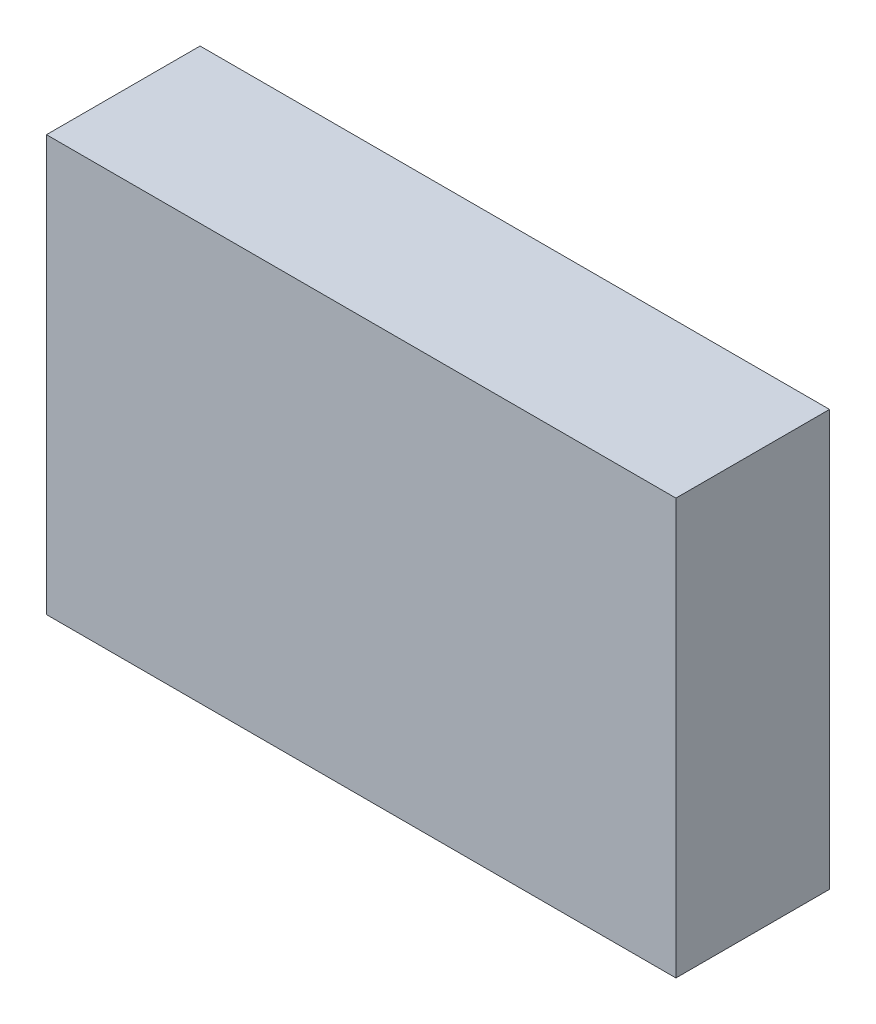
ISO-10303-21;
HEADER;
FILE_DESCRIPTION(('STEP AP214'),'2;1');
FILE_NAME('part.step','',(''),(''),'','','');
FILE_SCHEMA(('AUTOMOTIVE_DESIGN { 1 0 10303 214 1 1 1 1 }'));
ENDSEC;
DATA;
#1=APPLICATION_CONTEXT('core data for automotive mechanical design processes');
#2=APPLICATION_PROTOCOL_DEFINITION('international standard','automotive_design',2000,#1);
#3=PRODUCT_CONTEXT('',#1,'mechanical');
#4=PRODUCT('Part','Part','',(#3));
#5=PRODUCT_RELATED_PRODUCT_CATEGORY('part','',(#4));
#6=PRODUCT_DEFINITION_FORMATION('','',#4);
#7=PRODUCT_DEFINITION_CONTEXT('part definition',#1,'design');
#8=PRODUCT_DEFINITION('design','',#6,#7);
#9=PRODUCT_DEFINITION_SHAPE('','',#8);
#10=(LENGTH_UNIT() NAMED_UNIT(*) SI_UNIT(.MILLI.,.METRE.));
#11=(NAMED_UNIT(*) PLANE_ANGLE_UNIT() SI_UNIT($,.RADIAN.));
#12=(NAMED_UNIT(*) SI_UNIT($,.STERADIAN.) SOLID_ANGLE_UNIT());
#13=UNCERTAINTY_MEASURE_WITH_UNIT(LENGTH_MEASURE(1.E-05),#10,'distance_accuracy_value','');
#14=(GEOMETRIC_REPRESENTATION_CONTEXT(3) GLOBAL_UNCERTAINTY_ASSIGNED_CONTEXT((#13)) GLOBAL_UNIT_ASSIGNED_CONTEXT((#10,
#11,#12)) REPRESENTATION_CONTEXT('',''));
#15=CARTESIAN_POINT('',(0.,0.,0.));
#16=DIRECTION('',(0.,0.,1.));
#17=DIRECTION('',(1.,0.,0.));
#18=AXIS2_PLACEMENT_3D('',#15,#16,#17);
#19=CARTESIAN_POINT('',(104.5,-69.,25.5));
#20=DIRECTION('',(-1.,0.,0.));
#21=DIRECTION('',(0.,0.,1.));
#22=AXIS2_PLACEMENT_3D('',#19,#20,#21);
#23=PLANE('',#22);
#24=DIRECTION('',(0.,1.,0.));
#25=VECTOR('',#24,1.);
#26=CARTESIAN_POINT('',(104.5,-69.,-25.5));
#27=LINE('',#26,#25);
#28=CARTESIAN_POINT('',(104.5,-69.,-25.5));
#29=VERTEX_POINT('',#28);
#30=CARTESIAN_POINT('',(104.5,69.,-25.5));
#31=VERTEX_POINT('',#30);
#32=EDGE_CURVE('E100',#29,#31,#27,.T.);
#33=ORIENTED_EDGE('',*,*,#32,.T.);
#34=DIRECTION('',(0.,0.,-1.));
#35=VECTOR('',#34,1.);
#36=CARTESIAN_POINT('',(104.5,69.,25.5));
#37=LINE('',#36,#35);
#38=CARTESIAN_POINT('',(104.5,69.,25.5));
#39=VERTEX_POINT('',#38);
#40=EDGE_CURVE('E11',#39,#31,#37,.T.);
#41=ORIENTED_EDGE('',*,*,#40,.F.);
#42=DIRECTION('',(0.,1.,0.));
#43=VECTOR('',#42,1.);
#44=CARTESIAN_POINT('',(104.5,-69.,25.5));
#45=LINE('',#44,#43);
#46=CARTESIAN_POINT('',(104.5,-69.,25.5));
#47=VERTEX_POINT('',#46);
#48=EDGE_CURVE('E88',#47,#39,#45,.T.);
#49=ORIENTED_EDGE('',*,*,#48,.F.);
#50=DIRECTION('',(0.,0.,-1.));
#51=VECTOR('',#50,1.);
#52=CARTESIAN_POINT('',(104.5,-69.,25.5));
#53=LINE('',#52,#51);
#54=EDGE_CURVE('E96',#47,#29,#53,.T.);
#55=ORIENTED_EDGE('',*,*,#54,.T.);
#56=EDGE_LOOP('',(#33,#41,#49,#55));
#57=FACE_BOUND('',#56,.T.);
#58=ADVANCED_FACE('F37',(#57),#23,.F.);
#59=CARTESIAN_POINT('',(-104.5,69.,25.5));
#60=DIRECTION('',(0.,-1.,0.));
#61=DIRECTION('',(0.,0.,-1.));
#62=AXIS2_PLACEMENT_3D('',#59,#60,#61);
#63=PLANE('',#62);
#64=DIRECTION('',(-1.,0.,0.));
#65=VECTOR('',#64,1.);
#66=CARTESIAN_POINT('',(-104.5,69.,-25.5));
#67=LINE('',#66,#65);
#68=CARTESIAN_POINT('',(-104.5,69.,-25.5));
#69=VERTEX_POINT('',#68);
#70=EDGE_CURVE('E92',#31,#69,#67,.T.);
#71=ORIENTED_EDGE('',*,*,#70,.T.);
#72=DIRECTION('',(0.,0.,-1.));
#73=VECTOR('',#72,1.);
#74=CARTESIAN_POINT('',(-104.5,69.,25.5));
#75=LINE('',#74,#73);
#76=CARTESIAN_POINT('',(-104.5,69.,25.5));
#77=VERTEX_POINT('',#76);
#78=EDGE_CURVE('E45',#77,#69,#75,.T.);
#79=ORIENTED_EDGE('',*,*,#78,.F.);
#80=DIRECTION('',(-1.,0.,0.));
#81=VECTOR('',#80,1.);
#82=CARTESIAN_POINT('',(-104.5,69.,25.5));
#83=LINE('',#82,#81);
#84=EDGE_CURVE('E83',#39,#77,#83,.T.);
#85=ORIENTED_EDGE('',*,*,#84,.F.);
#86=ORIENTED_EDGE('',*,*,#40,.T.);
#87=EDGE_LOOP('',(#71,#79,#85,#86));
#88=FACE_BOUND('',#87,.T.);
#89=ADVANCED_FACE('F91',(#88),#63,.F.);
#90=CARTESIAN_POINT('',(-104.5,-69.,25.5));
#91=DIRECTION('',(1.,0.,0.));
#92=DIRECTION('',(0.,0.,-1.));
#93=AXIS2_PLACEMENT_3D('',#90,#91,#92);
#94=PLANE('',#93);
#95=DIRECTION('',(0.,-1.,0.));
#96=VECTOR('',#95,1.);
#97=CARTESIAN_POINT('',(-104.5,-69.,-25.5));
#98=LINE('',#97,#96);
#99=CARTESIAN_POINT('',(-104.5,-69.,-25.5));
#100=VERTEX_POINT('',#99);
#101=EDGE_CURVE('E70',#69,#100,#98,.T.);
#102=ORIENTED_EDGE('',*,*,#101,.T.);
#103=DIRECTION('',(0.,0.,-1.));
#104=VECTOR('',#103,1.);
#105=CARTESIAN_POINT('',(-104.5,-69.,25.5));
#106=LINE('',#105,#104);
#107=CARTESIAN_POINT('',(-104.5,-69.,25.5));
#108=VERTEX_POINT('',#107);
#109=EDGE_CURVE('E93',#108,#100,#106,.T.);
#110=ORIENTED_EDGE('',*,*,#109,.F.);
#111=DIRECTION('',(0.,-1.,0.));
#112=VECTOR('',#111,1.);
#113=CARTESIAN_POINT('',(-104.5,-69.,25.5));
#114=LINE('',#113,#112);
#115=EDGE_CURVE('E86',#77,#108,#114,.T.);
#116=ORIENTED_EDGE('',*,*,#115,.F.);
#117=ORIENTED_EDGE('',*,*,#78,.T.);
#118=EDGE_LOOP('',(#102,#110,#116,#117));
#119=FACE_BOUND('',#118,.T.);
#120=ADVANCED_FACE('F94',(#119),#94,.F.);
#121=CARTESIAN_POINT('',(-104.5,-69.,25.5));
#122=DIRECTION('',(0.,1.,0.));
#123=DIRECTION('',(0.,0.,1.));
#124=AXIS2_PLACEMENT_3D('',#121,#122,#123);
#125=PLANE('',#124);
#126=DIRECTION('',(1.,0.,0.));
#127=VECTOR('',#126,1.);
#128=CARTESIAN_POINT('',(-104.5,-69.,-25.5));
#129=LINE('',#128,#127);
#130=EDGE_CURVE('E76',#100,#29,#129,.T.);
#131=ORIENTED_EDGE('',*,*,#130,.T.);
#132=ORIENTED_EDGE('',*,*,#54,.F.);
#133=DIRECTION('',(1.,0.,0.));
#134=VECTOR('',#133,1.);
#135=CARTESIAN_POINT('',(-104.5,-69.,25.5));
#136=LINE('',#135,#134);
#137=EDGE_CURVE('E53',#108,#47,#136,.T.);
#138=ORIENTED_EDGE('',*,*,#137,.F.);
#139=ORIENTED_EDGE('',*,*,#109,.T.);
#140=EDGE_LOOP('',(#131,#132,#138,#139));
#141=FACE_BOUND('',#140,.T.);
#142=ADVANCED_FACE('F107',(#141),#125,.F.);
#143=CARTESIAN_POINT('',(0.,0.,25.5));
#144=DIRECTION('',(0.,0.,-1.));
#145=DIRECTION('',(-1.,0.,0.));
#146=AXIS2_PLACEMENT_3D('',#143,#144,#145);
#147=PLANE('',#146);
#148=ORIENTED_EDGE('',*,*,#48,.T.);
#149=ORIENTED_EDGE('',*,*,#84,.T.);
#150=ORIENTED_EDGE('',*,*,#115,.T.);
#151=ORIENTED_EDGE('',*,*,#137,.T.);
#152=EDGE_LOOP('',(#148,#149,#150,#151));
#153=FACE_BOUND('',#152,.T.);
#154=ADVANCED_FACE('F84',(#153),#147,.F.);
#155=CARTESIAN_POINT('',(0.,0.,-25.5));
#156=DIRECTION('',(0.,0.,-1.));
#157=DIRECTION('',(-1.,0.,0.));
#158=AXIS2_PLACEMENT_3D('',#155,#156,#157);
#159=PLANE('',#158);
#160=ORIENTED_EDGE('',*,*,#32,.F.);
#161=ORIENTED_EDGE('',*,*,#130,.F.);
#162=ORIENTED_EDGE('',*,*,#101,.F.);
#163=ORIENTED_EDGE('',*,*,#70,.F.);
#164=EDGE_LOOP('',(#160,#161,#162,#163));
#165=FACE_BOUND('',#164,.T.);
#166=ADVANCED_FACE('F110',(#165),#159,.T.);
#167=CLOSED_SHELL('',(#58,#89,#120,#142,#154,#166));
#168=MANIFOLD_SOLID_BREP('B2',#167);
#169=ADVANCED_BREP_SHAPE_REPRESENTATION('',(#18,#168),#14);
#170=SHAPE_DEFINITION_REPRESENTATION(#9,#169);
ENDSEC;
END-ISO-10303-21;
